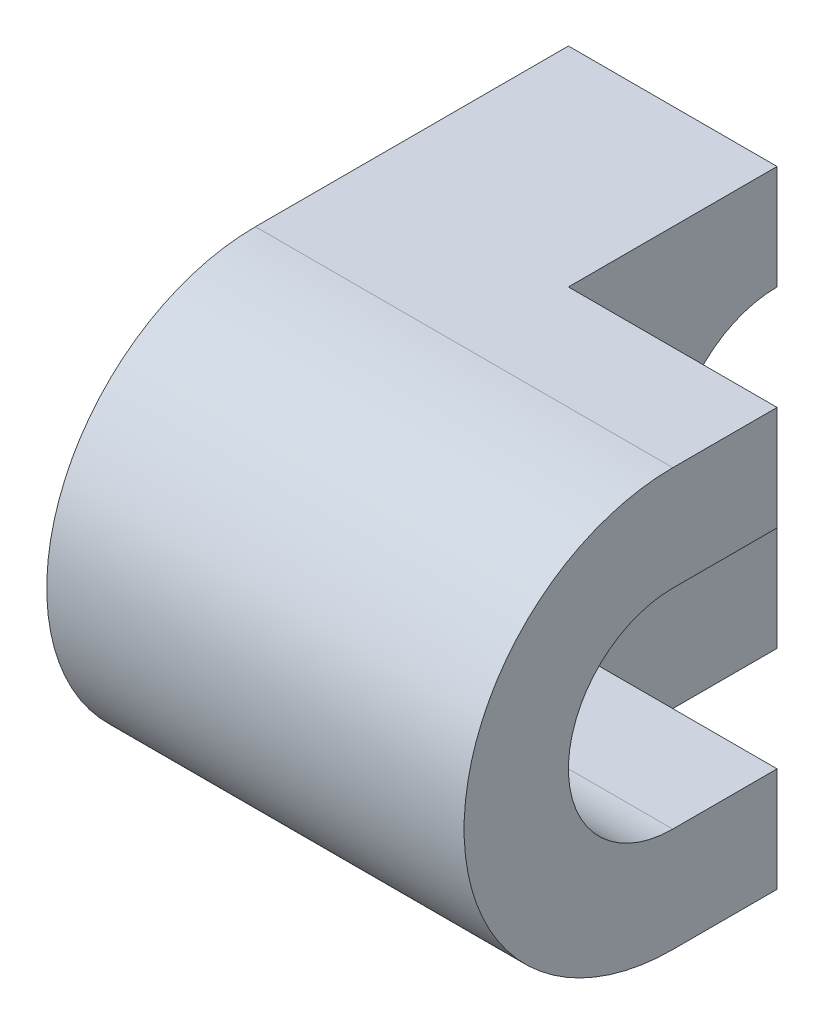
ISO-10303-21;
HEADER;
FILE_DESCRIPTION(('STEP AP214'),'2;1');
FILE_NAME('part.step','',(''),(''),'','','');
FILE_SCHEMA(('AUTOMOTIVE_DESIGN { 1 0 10303 214 1 1 1 1 }'));
ENDSEC;
DATA;
#1=APPLICATION_CONTEXT('core data for automotive mechanical design processes');
#2=APPLICATION_PROTOCOL_DEFINITION('international standard','automotive_design',2000,#1);
#3=PRODUCT_CONTEXT('',#1,'mechanical');
#4=PRODUCT('Part','Part','',(#3));
#5=PRODUCT_RELATED_PRODUCT_CATEGORY('part','',(#4));
#6=PRODUCT_DEFINITION_FORMATION('','',#4);
#7=PRODUCT_DEFINITION_CONTEXT('part definition',#1,'design');
#8=PRODUCT_DEFINITION('design','',#6,#7);
#9=PRODUCT_DEFINITION_SHAPE('','',#8);
#10=(LENGTH_UNIT() NAMED_UNIT(*) SI_UNIT(.MILLI.,.METRE.));
#11=(NAMED_UNIT(*) PLANE_ANGLE_UNIT() SI_UNIT($,.RADIAN.));
#12=(NAMED_UNIT(*) SI_UNIT($,.STERADIAN.) SOLID_ANGLE_UNIT());
#13=UNCERTAINTY_MEASURE_WITH_UNIT(LENGTH_MEASURE(1.E-05),#10,'distance_accuracy_value','');
#14=(GEOMETRIC_REPRESENTATION_CONTEXT(3) GLOBAL_UNCERTAINTY_ASSIGNED_CONTEXT((#13)) GLOBAL_UNIT_ASSIGNED_CONTEXT((#10,
#11,#12)) REPRESENTATION_CONTEXT('',''));
#15=CARTESIAN_POINT('',(0.,0.,0.));
#16=DIRECTION('',(0.,0.,1.));
#17=DIRECTION('',(1.,0.,0.));
#18=AXIS2_PLACEMENT_3D('',#15,#16,#17);
#19=CARTESIAN_POINT('',(20.,0.,0.));
#20=DIRECTION('',(-1.,0.,0.));
#21=DIRECTION('',(0.,0.,1.));
#22=AXIS2_PLACEMENT_3D('',#19,#20,#21);
#23=CYLINDRICAL_SURFACE('',#22,20.);
#24=CARTESIAN_POINT('',(0.,0.,0.));
#25=DIRECTION('',(1.,0.,0.));
#26=DIRECTION('',(0.,0.,-1.));
#27=AXIS2_PLACEMENT_3D('',#24,#25,#26);
#28=CIRCLE('',#27,20.);
#29=CARTESIAN_POINT('',(0.,20.,0.));
#30=VERTEX_POINT('',#29);
#31=CARTESIAN_POINT('',(0.,-20.,0.));
#32=VERTEX_POINT('',#31);
#33=EDGE_CURVE('E143',#30,#32,#28,.T.);
#34=ORIENTED_EDGE('',*,*,#33,.T.);
#35=DIRECTION('',(-1.,0.,0.));
#36=VECTOR('',#35,1.);
#37=CARTESIAN_POINT('',(20.,-20.,0.));
#38=LINE('',#37,#36);
#39=CARTESIAN_POINT('',(40.,-20.,0.));
#40=VERTEX_POINT('',#39);
#41=EDGE_CURVE('E11',#40,#32,#38,.T.);
#42=ORIENTED_EDGE('',*,*,#41,.F.);
#43=CARTESIAN_POINT('',(40.,0.,0.));
#44=DIRECTION('',(1.,0.,0.));
#45=DIRECTION('',(0.,0.,-1.));
#46=AXIS2_PLACEMENT_3D('',#43,#44,#45);
#47=CIRCLE('',#46,20.);
#48=CARTESIAN_POINT('',(40.,20.,0.));
#49=VERTEX_POINT('',#48);
#50=EDGE_CURVE('E238',#49,#40,#47,.T.);
#51=ORIENTED_EDGE('',*,*,#50,.F.);
#52=DIRECTION('',(-1.,0.,0.));
#53=VECTOR('',#52,1.);
#54=CARTESIAN_POINT('',(20.,20.,0.));
#55=LINE('',#54,#53);
#56=EDGE_CURVE('E162',#49,#30,#55,.T.);
#57=ORIENTED_EDGE('',*,*,#56,.T.);
#58=EDGE_LOOP('',(#34,#42,#51,#57));
#59=FACE_BOUND('',#58,.T.);
#60=ADVANCED_FACE('F35',(#59),#23,.T.);
#61=CARTESIAN_POINT('',(20.,-20.,-30.));
#62=DIRECTION('',(0.,1.,0.));
#63=DIRECTION('',(0.,0.,1.));
#64=AXIS2_PLACEMENT_3D('',#61,#62,#63);
#65=PLANE('',#64);
#66=DIRECTION('',(0.,0.,-1.));
#67=VECTOR('',#66,1.);
#68=CARTESIAN_POINT('',(0.,-20.,-30.));
#69=LINE('',#68,#67);
#70=CARTESIAN_POINT('',(0.,-20.,-30.));
#71=VERTEX_POINT('',#70);
#72=EDGE_CURVE('E146',#32,#71,#69,.T.);
#73=ORIENTED_EDGE('',*,*,#72,.T.);
#74=DIRECTION('',(-1.,0.,0.));
#75=VECTOR('',#74,1.);
#76=CARTESIAN_POINT('',(20.,-20.,-30.));
#77=LINE('',#76,#75);
#78=CARTESIAN_POINT('',(20.,-20.,-30.));
#79=VERTEX_POINT('',#78);
#80=EDGE_CURVE('E42',#79,#71,#77,.T.);
#81=ORIENTED_EDGE('',*,*,#80,.F.);
#82=DIRECTION('',(0.,0.,-1.));
#83=VECTOR('',#82,1.);
#84=CARTESIAN_POINT('',(20.,-20.,-30.));
#85=LINE('',#84,#83);
#86=CARTESIAN_POINT('',(20.,-20.,-10.));
#87=VERTEX_POINT('',#86);
#88=EDGE_CURVE('E152',#87,#79,#85,.T.);
#89=ORIENTED_EDGE('',*,*,#88,.F.);
#90=DIRECTION('',(-1.,0.,0.));
#91=VECTOR('',#90,1.);
#92=CARTESIAN_POINT('',(40.,-20.,-10.));
#93=LINE('',#92,#91);
#94=CARTESIAN_POINT('',(40.,-20.,-10.));
#95=VERTEX_POINT('',#94);
#96=EDGE_CURVE('E213',#95,#87,#93,.T.);
#97=ORIENTED_EDGE('',*,*,#96,.F.);
#98=DIRECTION('',(0.,0.,-1.));
#99=VECTOR('',#98,1.);
#100=CARTESIAN_POINT('',(40.,-20.,-10.));
#101=LINE('',#100,#99);
#102=EDGE_CURVE('E236',#40,#95,#101,.T.);
#103=ORIENTED_EDGE('',*,*,#102,.F.);
#104=ORIENTED_EDGE('',*,*,#41,.T.);
#105=EDGE_LOOP('',(#73,#81,#89,#97,#103,#104));
#106=FACE_BOUND('',#105,.T.);
#107=ADVANCED_FACE('F211',(#106),#65,.F.);
#108=CARTESIAN_POINT('',(20.,-10.,-30.));
#109=DIRECTION('',(0.,0.,1.));
#110=DIRECTION('',(1.,0.,0.));
#111=AXIS2_PLACEMENT_3D('',#108,#109,#110);
#112=PLANE('',#111);
#113=DIRECTION('',(0.,1.,0.));
#114=VECTOR('',#113,1.);
#115=CARTESIAN_POINT('',(0.,-10.,-30.));
#116=LINE('',#115,#114);
#117=CARTESIAN_POINT('',(0.,-10.,-30.));
#118=VERTEX_POINT('',#117);
#119=EDGE_CURVE('E165',#71,#118,#116,.T.);
#120=ORIENTED_EDGE('',*,*,#119,.T.);
#121=DIRECTION('',(-1.,0.,0.));
#122=VECTOR('',#121,1.);
#123=CARTESIAN_POINT('',(20.,-10.,-30.));
#124=LINE('',#123,#122);
#125=CARTESIAN_POINT('',(20.,-10.,-30.));
#126=VERTEX_POINT('',#125);
#127=EDGE_CURVE('E180',#126,#118,#124,.T.);
#128=ORIENTED_EDGE('',*,*,#127,.F.);
#129=DIRECTION('',(0.,1.,0.));
#130=VECTOR('',#129,1.);
#131=CARTESIAN_POINT('',(20.,-10.,-30.));
#132=LINE('',#131,#130);
#133=EDGE_CURVE('E154',#79,#126,#132,.T.);
#134=ORIENTED_EDGE('',*,*,#133,.F.);
#135=ORIENTED_EDGE('',*,*,#80,.T.);
#136=EDGE_LOOP('',(#120,#128,#134,#135));
#137=FACE_BOUND('',#136,.T.);
#138=ADVANCED_FACE('F187',(#137),#112,.F.);
#139=CARTESIAN_POINT('',(20.,0.,-30.));
#140=DIRECTION('',(-1.,0.,0.));
#141=DIRECTION('',(0.,0.,1.));
#142=AXIS2_PLACEMENT_3D('',#139,#140,#141);
#143=CYLINDRICAL_SURFACE('',#142,10.);
#144=CARTESIAN_POINT('',(0.,0.,-30.));
#145=DIRECTION('',(-1.,0.,0.));
#146=DIRECTION('',(0.,0.,-1.));
#147=AXIS2_PLACEMENT_3D('',#144,#145,#146);
#148=CIRCLE('',#147,10.);
#149=CARTESIAN_POINT('',(0.,10.,-30.));
#150=VERTEX_POINT('',#149);
#151=EDGE_CURVE('E167',#118,#150,#148,.T.);
#152=ORIENTED_EDGE('',*,*,#151,.T.);
#153=DIRECTION('',(-1.,0.,0.));
#154=VECTOR('',#153,1.);
#155=CARTESIAN_POINT('',(20.,10.,-30.));
#156=LINE('',#155,#154);
#157=CARTESIAN_POINT('',(20.,10.,-30.));
#158=VERTEX_POINT('',#157);
#159=EDGE_CURVE('E177',#158,#150,#156,.T.);
#160=ORIENTED_EDGE('',*,*,#159,.F.);
#161=CARTESIAN_POINT('',(20.,0.,-30.));
#162=DIRECTION('',(-1.,0.,0.));
#163=DIRECTION('',(0.,0.,-1.));
#164=AXIS2_PLACEMENT_3D('',#161,#162,#163);
#165=CIRCLE('',#164,10.);
#166=EDGE_CURVE('E157',#126,#158,#165,.T.);
#167=ORIENTED_EDGE('',*,*,#166,.F.);
#168=ORIENTED_EDGE('',*,*,#127,.T.);
#169=EDGE_LOOP('',(#152,#160,#167,#168));
#170=FACE_BOUND('',#169,.T.);
#171=ADVANCED_FACE('F199',(#170),#143,.F.);
#172=CARTESIAN_POINT('',(20.,20.,-30.));
#173=DIRECTION('',(0.,0.,1.));
#174=DIRECTION('',(1.,0.,0.));
#175=AXIS2_PLACEMENT_3D('',#172,#173,#174);
#176=PLANE('',#175);
#177=DIRECTION('',(0.,1.,0.));
#178=VECTOR('',#177,1.);
#179=CARTESIAN_POINT('',(0.,20.,-30.));
#180=LINE('',#179,#178);
#181=CARTESIAN_POINT('',(0.,20.,-30.));
#182=VERTEX_POINT('',#181);
#183=EDGE_CURVE('E169',#150,#182,#180,.T.);
#184=ORIENTED_EDGE('',*,*,#183,.T.);
#185=DIRECTION('',(-1.,0.,0.));
#186=VECTOR('',#185,1.);
#187=CARTESIAN_POINT('',(20.,20.,-30.));
#188=LINE('',#187,#186);
#189=CARTESIAN_POINT('',(20.,20.,-30.));
#190=VERTEX_POINT('',#189);
#191=EDGE_CURVE('E174',#190,#182,#188,.T.);
#192=ORIENTED_EDGE('',*,*,#191,.F.);
#193=DIRECTION('',(0.,1.,0.));
#194=VECTOR('',#193,1.);
#195=CARTESIAN_POINT('',(20.,20.,-30.));
#196=LINE('',#195,#194);
#197=EDGE_CURVE('E159',#158,#190,#196,.T.);
#198=ORIENTED_EDGE('',*,*,#197,.F.);
#199=ORIENTED_EDGE('',*,*,#159,.T.);
#200=EDGE_LOOP('',(#184,#192,#198,#199));
#201=FACE_BOUND('',#200,.T.);
#202=ADVANCED_FACE('F203',(#201),#176,.F.);
#203=CARTESIAN_POINT('',(20.,20.,0.));
#204=DIRECTION('',(0.,-1.,0.));
#205=DIRECTION('',(0.,0.,-1.));
#206=AXIS2_PLACEMENT_3D('',#203,#204,#205);
#207=PLANE('',#206);
#208=DIRECTION('',(0.,0.,1.));
#209=VECTOR('',#208,1.);
#210=CARTESIAN_POINT('',(0.,20.,0.));
#211=LINE('',#210,#209);
#212=EDGE_CURVE('E155',#182,#30,#211,.T.);
#213=ORIENTED_EDGE('',*,*,#212,.T.);
#214=ORIENTED_EDGE('',*,*,#56,.F.);
#215=DIRECTION('',(0.,0.,1.));
#216=VECTOR('',#215,1.);
#217=CARTESIAN_POINT('',(40.,20.,0.));
#218=LINE('',#217,#216);
#219=CARTESIAN_POINT('',(40.,20.,-10.));
#220=VERTEX_POINT('',#219);
#221=EDGE_CURVE('E241',#220,#49,#218,.T.);
#222=ORIENTED_EDGE('',*,*,#221,.F.);
#223=DIRECTION('',(-1.,0.,0.));
#224=VECTOR('',#223,1.);
#225=CARTESIAN_POINT('',(40.,20.,-10.));
#226=LINE('',#225,#224);
#227=CARTESIAN_POINT('',(20.,20.,-10.));
#228=VERTEX_POINT('',#227);
#229=EDGE_CURVE('E148',#220,#228,#226,.T.);
#230=ORIENTED_EDGE('',*,*,#229,.T.);
#231=DIRECTION('',(0.,0.,1.));
#232=VECTOR('',#231,1.);
#233=CARTESIAN_POINT('',(20.,20.,0.));
#234=LINE('',#233,#232);
#235=EDGE_CURVE('E161',#190,#228,#234,.T.);
#236=ORIENTED_EDGE('',*,*,#235,.F.);
#237=ORIENTED_EDGE('',*,*,#191,.T.);
#238=EDGE_LOOP('',(#213,#214,#222,#230,#236,#237));
#239=FACE_BOUND('',#238,.T.);
#240=ADVANCED_FACE('F250',(#239),#207,.F.);
#241=CARTESIAN_POINT('',(20.,0.,0.));
#242=DIRECTION('',(1.,0.,0.));
#243=DIRECTION('',(0.,0.,-1.));
#244=AXIS2_PLACEMENT_3D('',#241,#242,#243);
#245=PLANE('',#244);
#246=DIRECTION('',(0.,1.,0.));
#247=VECTOR('',#246,1.);
#248=CARTESIAN_POINT('',(20.,-10.,-10.));
#249=LINE('',#248,#247);
#250=CARTESIAN_POINT('',(20.,-10.,-10.));
#251=VERTEX_POINT('',#250);
#252=EDGE_CURVE('E208',#87,#251,#249,.T.);
#253=ORIENTED_EDGE('',*,*,#252,.F.);
#254=ORIENTED_EDGE('',*,*,#88,.T.);
#255=ORIENTED_EDGE('',*,*,#133,.T.);
#256=ORIENTED_EDGE('',*,*,#166,.T.);
#257=ORIENTED_EDGE('',*,*,#197,.T.);
#258=ORIENTED_EDGE('',*,*,#235,.T.);
#259=DIRECTION('',(0.,1.,0.));
#260=VECTOR('',#259,1.);
#261=CARTESIAN_POINT('',(20.,20.,-10.));
#262=LINE('',#261,#260);
#263=CARTESIAN_POINT('',(20.,10.,-10.));
#264=VERTEX_POINT('',#263);
#265=EDGE_CURVE('E229',#264,#228,#262,.T.);
#266=ORIENTED_EDGE('',*,*,#265,.F.);
#267=DIRECTION('',(0.,0.,-1.));
#268=VECTOR('',#267,1.);
#269=CARTESIAN_POINT('',(20.,10.,0.));
#270=LINE('',#269,#268);
#271=CARTESIAN_POINT('',(20.,10.,0.));
#272=VERTEX_POINT('',#271);
#273=EDGE_CURVE('E231',#272,#264,#270,.T.);
#274=ORIENTED_EDGE('',*,*,#273,.F.);
#275=CARTESIAN_POINT('',(20.,0.,0.));
#276=DIRECTION('',(-1.,0.,0.));
#277=DIRECTION('',(0.,0.,-1.));
#278=AXIS2_PLACEMENT_3D('',#275,#276,#277);
#279=CIRCLE('',#278,10.);
#280=CARTESIAN_POINT('',(20.,-10.,0.));
#281=VERTEX_POINT('',#280);
#282=EDGE_CURVE('E54',#281,#272,#279,.T.);
#283=ORIENTED_EDGE('',*,*,#282,.F.);
#284=DIRECTION('',(0.,0.,1.));
#285=VECTOR('',#284,1.);
#286=CARTESIAN_POINT('',(20.,-10.,0.));
#287=LINE('',#286,#285);
#288=EDGE_CURVE('E49',#251,#281,#287,.T.);
#289=ORIENTED_EDGE('',*,*,#288,.F.);
#290=EDGE_LOOP('',(#253,#254,#255,#256,#257,#258,#266,#274,#283,#289));
#291=FACE_BOUND('',#290,.T.);
#292=ADVANCED_FACE('F206',(#291),#245,.T.);
#293=CARTESIAN_POINT('',(0.,0.,0.));
#294=DIRECTION('',(1.,0.,0.));
#295=DIRECTION('',(0.,0.,-1.));
#296=AXIS2_PLACEMENT_3D('',#293,#294,#295);
#297=PLANE('',#296);
#298=ORIENTED_EDGE('',*,*,#33,.F.);
#299=ORIENTED_EDGE('',*,*,#212,.F.);
#300=ORIENTED_EDGE('',*,*,#183,.F.);
#301=ORIENTED_EDGE('',*,*,#151,.F.);
#302=ORIENTED_EDGE('',*,*,#119,.F.);
#303=ORIENTED_EDGE('',*,*,#72,.F.);
#304=EDGE_LOOP('',(#298,#299,#300,#301,#302,#303));
#305=FACE_BOUND('',#304,.T.);
#306=ADVANCED_FACE('F194',(#305),#297,.F.);
#307=CARTESIAN_POINT('',(40.,0.,0.));
#308=DIRECTION('',(-1.,0.,0.));
#309=DIRECTION('',(0.,0.,1.));
#310=AXIS2_PLACEMENT_3D('',#307,#308,#309);
#311=CYLINDRICAL_SURFACE('',#310,10.);
#312=ORIENTED_EDGE('',*,*,#282,.T.);
#313=DIRECTION('',(-1.,0.,0.));
#314=VECTOR('',#313,1.);
#315=CARTESIAN_POINT('',(40.,10.,0.));
#316=LINE('',#315,#314);
#317=CARTESIAN_POINT('',(40.,10.,0.));
#318=VERTEX_POINT('',#317);
#319=EDGE_CURVE('E126',#318,#272,#316,.T.);
#320=ORIENTED_EDGE('',*,*,#319,.F.);
#321=CARTESIAN_POINT('',(40.,0.,0.));
#322=DIRECTION('',(-1.,0.,0.));
#323=DIRECTION('',(0.,0.,-1.));
#324=AXIS2_PLACEMENT_3D('',#321,#322,#323);
#325=CIRCLE('',#324,10.);
#326=CARTESIAN_POINT('',(40.,-10.,0.));
#327=VERTEX_POINT('',#326);
#328=EDGE_CURVE('E132',#327,#318,#325,.T.);
#329=ORIENTED_EDGE('',*,*,#328,.F.);
#330=DIRECTION('',(-1.,0.,0.));
#331=VECTOR('',#330,1.);
#332=CARTESIAN_POINT('',(40.,-10.,0.));
#333=LINE('',#332,#331);
#334=EDGE_CURVE('E223',#327,#281,#333,.T.);
#335=ORIENTED_EDGE('',*,*,#334,.T.);
#336=EDGE_LOOP('',(#312,#320,#329,#335));
#337=FACE_BOUND('',#336,.T.);
#338=ADVANCED_FACE('F142',(#337),#311,.F.);
#339=CARTESIAN_POINT('',(40.,10.,0.));
#340=DIRECTION('',(0.,1.,0.));
#341=DIRECTION('',(0.,0.,1.));
#342=AXIS2_PLACEMENT_3D('',#339,#340,#341);
#343=PLANE('',#342);
#344=ORIENTED_EDGE('',*,*,#273,.T.);
#345=DIRECTION('',(-1.,0.,0.));
#346=VECTOR('',#345,1.);
#347=CARTESIAN_POINT('',(40.,10.,-10.));
#348=LINE('',#347,#346);
#349=CARTESIAN_POINT('',(40.,10.,-10.));
#350=VERTEX_POINT('',#349);
#351=EDGE_CURVE('E128',#350,#264,#348,.T.);
#352=ORIENTED_EDGE('',*,*,#351,.F.);
#353=DIRECTION('',(0.,0.,-1.));
#354=VECTOR('',#353,1.);
#355=CARTESIAN_POINT('',(40.,10.,0.));
#356=LINE('',#355,#354);
#357=EDGE_CURVE('E121',#318,#350,#356,.T.);
#358=ORIENTED_EDGE('',*,*,#357,.F.);
#359=ORIENTED_EDGE('',*,*,#319,.T.);
#360=EDGE_LOOP('',(#344,#352,#358,#359));
#361=FACE_BOUND('',#360,.T.);
#362=ADVANCED_FACE('F124',(#361),#343,.F.);
#363=CARTESIAN_POINT('',(40.,20.,-10.));
#364=DIRECTION('',(0.,0.,1.));
#365=DIRECTION('',(0.,-1.,0.));
#366=AXIS2_PLACEMENT_3D('',#363,#364,#365);
#367=PLANE('',#366);
#368=ORIENTED_EDGE('',*,*,#265,.T.);
#369=ORIENTED_EDGE('',*,*,#229,.F.);
#370=DIRECTION('',(0.,1.,0.));
#371=VECTOR('',#370,1.);
#372=CARTESIAN_POINT('',(40.,20.,-10.));
#373=LINE('',#372,#371);
#374=EDGE_CURVE('E131',#350,#220,#373,.T.);
#375=ORIENTED_EDGE('',*,*,#374,.F.);
#376=ORIENTED_EDGE('',*,*,#351,.T.);
#377=EDGE_LOOP('',(#368,#369,#375,#376));
#378=FACE_BOUND('',#377,.T.);
#379=ADVANCED_FACE('F248',(#378),#367,.F.);
#380=CARTESIAN_POINT('',(40.,-10.,-10.));
#381=DIRECTION('',(0.,0.,1.));
#382=DIRECTION('',(0.,-1.,0.));
#383=AXIS2_PLACEMENT_3D('',#380,#381,#382);
#384=PLANE('',#383);
#385=ORIENTED_EDGE('',*,*,#252,.T.);
#386=DIRECTION('',(-1.,0.,0.));
#387=VECTOR('',#386,1.);
#388=CARTESIAN_POINT('',(40.,-10.,-10.));
#389=LINE('',#388,#387);
#390=CARTESIAN_POINT('',(40.,-10.,-10.));
#391=VERTEX_POINT('',#390);
#392=EDGE_CURVE('E220',#391,#251,#389,.T.);
#393=ORIENTED_EDGE('',*,*,#392,.F.);
#394=DIRECTION('',(0.,1.,0.));
#395=VECTOR('',#394,1.);
#396=CARTESIAN_POINT('',(40.,-10.,-10.));
#397=LINE('',#396,#395);
#398=EDGE_CURVE('E219',#95,#391,#397,.T.);
#399=ORIENTED_EDGE('',*,*,#398,.F.);
#400=ORIENTED_EDGE('',*,*,#96,.T.);
#401=EDGE_LOOP('',(#385,#393,#399,#400));
#402=FACE_BOUND('',#401,.T.);
#403=ADVANCED_FACE('F216',(#402),#384,.F.);
#404=CARTESIAN_POINT('',(40.,-10.,0.));
#405=DIRECTION('',(0.,-1.,0.));
#406=DIRECTION('',(0.,0.,-1.));
#407=AXIS2_PLACEMENT_3D('',#404,#405,#406);
#408=PLANE('',#407);
#409=ORIENTED_EDGE('',*,*,#288,.T.);
#410=ORIENTED_EDGE('',*,*,#334,.F.);
#411=DIRECTION('',(0.,0.,1.));
#412=VECTOR('',#411,1.);
#413=CARTESIAN_POINT('',(40.,-10.,0.));
#414=LINE('',#413,#412);
#415=EDGE_CURVE('E137',#391,#327,#414,.T.);
#416=ORIENTED_EDGE('',*,*,#415,.F.);
#417=ORIENTED_EDGE('',*,*,#392,.T.);
#418=EDGE_LOOP('',(#409,#410,#416,#417));
#419=FACE_BOUND('',#418,.T.);
#420=ADVANCED_FACE('F253',(#419),#408,.F.);
#421=CARTESIAN_POINT('',(40.,0.,0.));
#422=DIRECTION('',(1.,0.,0.));
#423=DIRECTION('',(0.,0.,-1.));
#424=AXIS2_PLACEMENT_3D('',#421,#422,#423);
#425=PLANE('',#424);
#426=ORIENTED_EDGE('',*,*,#328,.T.);
#427=ORIENTED_EDGE('',*,*,#357,.T.);
#428=ORIENTED_EDGE('',*,*,#374,.T.);
#429=ORIENTED_EDGE('',*,*,#221,.T.);
#430=ORIENTED_EDGE('',*,*,#50,.T.);
#431=ORIENTED_EDGE('',*,*,#102,.T.);
#432=ORIENTED_EDGE('',*,*,#398,.T.);
#433=ORIENTED_EDGE('',*,*,#415,.T.);
#434=EDGE_LOOP('',(#426,#427,#428,#429,#430,#431,#432,#433));
#435=FACE_BOUND('',#434,.T.);
#436=ADVANCED_FACE('F135',(#435),#425,.T.);
#437=CLOSED_SHELL('',(#60,#107,#138,#171,#202,#240,#292,#306,#338,#362,#379,#403,#420,#436));
#438=MANIFOLD_SOLID_BREP('B2',#437);
#439=ADVANCED_BREP_SHAPE_REPRESENTATION('',(#18,#438),#14);
#440=SHAPE_DEFINITION_REPRESENTATION(#9,#439);
ENDSEC;
END-ISO-10303-21;
